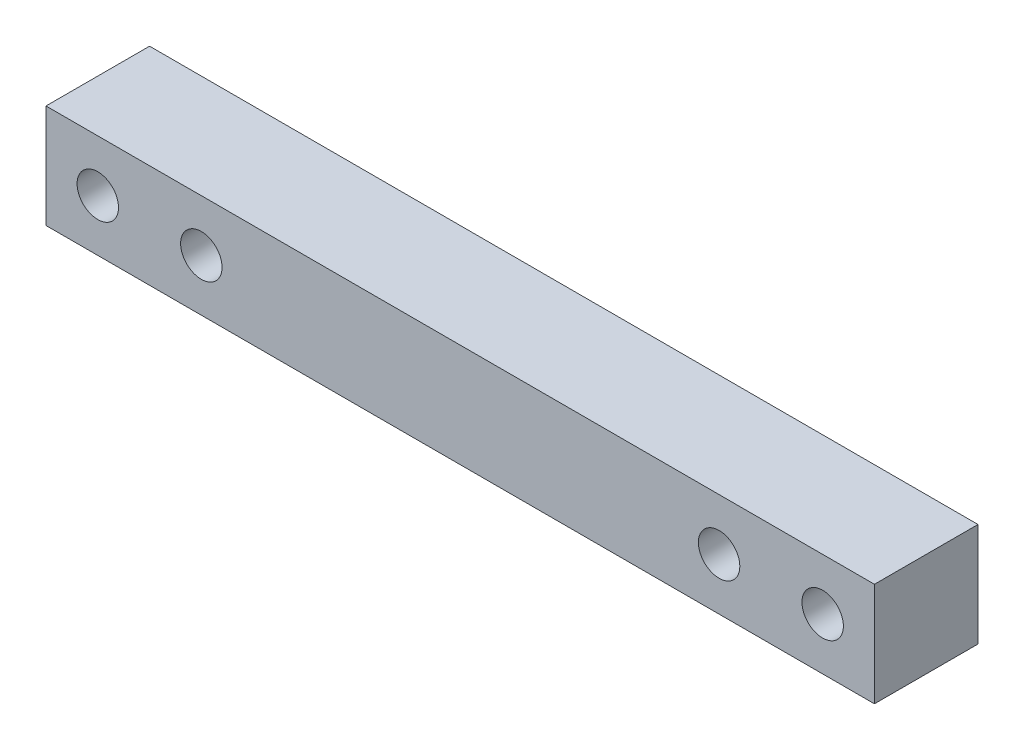
ISO-10303-21;
HEADER;
FILE_DESCRIPTION(('STEP AP214'),'2;1');
FILE_NAME('part.step','',(''),(''),'','','');
FILE_SCHEMA(('AUTOMOTIVE_DESIGN { 1 0 10303 214 1 1 1 1 }'));
ENDSEC;
DATA;
#1=APPLICATION_CONTEXT('core data for automotive mechanical design processes');
#2=APPLICATION_PROTOCOL_DEFINITION('international standard','automotive_design',2000,#1);
#3=PRODUCT_CONTEXT('',#1,'mechanical');
#4=PRODUCT('Part','Part','',(#3));
#5=PRODUCT_RELATED_PRODUCT_CATEGORY('part','',(#4));
#6=PRODUCT_DEFINITION_FORMATION('','',#4);
#7=PRODUCT_DEFINITION_CONTEXT('part definition',#1,'design');
#8=PRODUCT_DEFINITION('design','',#6,#7);
#9=PRODUCT_DEFINITION_SHAPE('','',#8);
#10=(LENGTH_UNIT() NAMED_UNIT(*) SI_UNIT(.MILLI.,.METRE.));
#11=(NAMED_UNIT(*) PLANE_ANGLE_UNIT() SI_UNIT($,.RADIAN.));
#12=(NAMED_UNIT(*) SI_UNIT($,.STERADIAN.) SOLID_ANGLE_UNIT());
#13=UNCERTAINTY_MEASURE_WITH_UNIT(LENGTH_MEASURE(1.E-05),#10,'distance_accuracy_value','');
#14=(GEOMETRIC_REPRESENTATION_CONTEXT(3) GLOBAL_UNCERTAINTY_ASSIGNED_CONTEXT((#13)) GLOBAL_UNIT_ASSIGNED_CONTEXT((#10,
#11,#12)) REPRESENTATION_CONTEXT('',''));
#15=CARTESIAN_POINT('',(0.,0.,0.));
#16=DIRECTION('',(0.,0.,1.));
#17=DIRECTION('',(1.,0.,0.));
#18=AXIS2_PLACEMENT_3D('',#15,#16,#17);
#19=CARTESIAN_POINT('',(-40.,-5.00000000000001,10.));
#20=DIRECTION('',(1.,0.,0.));
#21=DIRECTION('',(0.,0.,-1.));
#22=AXIS2_PLACEMENT_3D('',#19,#20,#21);
#23=PLANE('',#22);
#24=DIRECTION('',(0.,-1.,0.));
#25=VECTOR('',#24,1.);
#26=CARTESIAN_POINT('',(-40.,-5.00000000000001,0.));
#27=LINE('',#26,#25);
#28=CARTESIAN_POINT('',(-40.,4.99999999999999,0.));
#29=VERTEX_POINT('',#28);
#30=CARTESIAN_POINT('',(-40.,-5.00000000000001,0.));
#31=VERTEX_POINT('',#30);
#32=EDGE_CURVE('E98',#29,#31,#27,.T.);
#33=ORIENTED_EDGE('',*,*,#32,.T.);
#34=DIRECTION('',(0.,0.,-1.));
#35=VECTOR('',#34,1.);
#36=CARTESIAN_POINT('',(-40.,-5.00000000000001,10.));
#37=LINE('',#36,#35);
#38=CARTESIAN_POINT('',(-40.,-5.00000000000001,10.));
#39=VERTEX_POINT('',#38);
#40=EDGE_CURVE('E11',#39,#31,#37,.T.);
#41=ORIENTED_EDGE('',*,*,#40,.F.);
#42=DIRECTION('',(0.,-1.,0.));
#43=VECTOR('',#42,1.);
#44=CARTESIAN_POINT('',(-40.,-5.00000000000001,10.));
#45=LINE('',#44,#43);
#46=CARTESIAN_POINT('',(-40.,4.99999999999999,10.));
#47=VERTEX_POINT('',#46);
#48=EDGE_CURVE('E86',#47,#39,#45,.T.);
#49=ORIENTED_EDGE('',*,*,#48,.F.);
#50=DIRECTION('',(0.,0.,-1.));
#51=VECTOR('',#50,1.);
#52=CARTESIAN_POINT('',(-40.,4.99999999999999,10.));
#53=LINE('',#52,#51);
#54=EDGE_CURVE('E94',#47,#29,#53,.T.);
#55=ORIENTED_EDGE('',*,*,#54,.T.);
#56=EDGE_LOOP('',(#33,#41,#49,#55));
#57=FACE_BOUND('',#56,.T.);
#58=ADVANCED_FACE('F35',(#57),#23,.F.);
#59=CARTESIAN_POINT('',(40.,-5.,10.));
#60=DIRECTION('',(0.,1.,0.));
#61=DIRECTION('',(-1.,0.,0.));
#62=AXIS2_PLACEMENT_3D('',#59,#60,#61);
#63=PLANE('',#62);
#64=DIRECTION('',(1.,0.,0.));
#65=VECTOR('',#64,1.);
#66=CARTESIAN_POINT('',(40.,-5.,0.));
#67=LINE('',#66,#65);
#68=CARTESIAN_POINT('',(40.,-5.,0.));
#69=VERTEX_POINT('',#68);
#70=EDGE_CURVE('E90',#31,#69,#67,.T.);
#71=ORIENTED_EDGE('',*,*,#70,.T.);
#72=DIRECTION('',(0.,0.,-1.));
#73=VECTOR('',#72,1.);
#74=CARTESIAN_POINT('',(40.,-5.,10.));
#75=LINE('',#74,#73);
#76=CARTESIAN_POINT('',(40.,-5.,10.));
#77=VERTEX_POINT('',#76);
#78=EDGE_CURVE('E43',#77,#69,#75,.T.);
#79=ORIENTED_EDGE('',*,*,#78,.F.);
#80=DIRECTION('',(1.,0.,0.));
#81=VECTOR('',#80,1.);
#82=CARTESIAN_POINT('',(40.,-5.,10.));
#83=LINE('',#82,#81);
#84=EDGE_CURVE('E81',#39,#77,#83,.T.);
#85=ORIENTED_EDGE('',*,*,#84,.F.);
#86=ORIENTED_EDGE('',*,*,#40,.T.);
#87=EDGE_LOOP('',(#71,#79,#85,#86));
#88=FACE_BOUND('',#87,.T.);
#89=ADVANCED_FACE('F89',(#88),#63,.F.);
#90=CARTESIAN_POINT('',(40.,-5.,10.));
#91=DIRECTION('',(-1.,0.,0.));
#92=DIRECTION('',(0.,0.,1.));
#93=AXIS2_PLACEMENT_3D('',#90,#91,#92);
#94=PLANE('',#93);
#95=DIRECTION('',(0.,1.,0.));
#96=VECTOR('',#95,1.);
#97=CARTESIAN_POINT('',(40.,-5.,0.));
#98=LINE('',#97,#96);
#99=CARTESIAN_POINT('',(40.,5.,0.));
#100=VERTEX_POINT('',#99);
#101=EDGE_CURVE('E68',#69,#100,#98,.T.);
#102=ORIENTED_EDGE('',*,*,#101,.T.);
#103=DIRECTION('',(0.,0.,-1.));
#104=VECTOR('',#103,1.);
#105=CARTESIAN_POINT('',(40.,5.,10.));
#106=LINE('',#105,#104);
#107=CARTESIAN_POINT('',(40.,5.,10.));
#108=VERTEX_POINT('',#107);
#109=EDGE_CURVE('E91',#108,#100,#106,.T.);
#110=ORIENTED_EDGE('',*,*,#109,.F.);
#111=DIRECTION('',(0.,1.,0.));
#112=VECTOR('',#111,1.);
#113=CARTESIAN_POINT('',(40.,-5.,10.));
#114=LINE('',#113,#112);
#115=EDGE_CURVE('E84',#77,#108,#114,.T.);
#116=ORIENTED_EDGE('',*,*,#115,.F.);
#117=ORIENTED_EDGE('',*,*,#78,.T.);
#118=EDGE_LOOP('',(#102,#110,#116,#117));
#119=FACE_BOUND('',#118,.T.);
#120=ADVANCED_FACE('F92',(#119),#94,.F.);
#121=CARTESIAN_POINT('',(40.,5.,10.));
#122=DIRECTION('',(0.,-1.,0.));
#123=DIRECTION('',(1.,0.,0.));
#124=AXIS2_PLACEMENT_3D('',#121,#122,#123);
#125=PLANE('',#124);
#126=DIRECTION('',(-1.,0.,0.));
#127=VECTOR('',#126,1.);
#128=CARTESIAN_POINT('',(40.,5.,0.));
#129=LINE('',#128,#127);
#130=EDGE_CURVE('E74',#100,#29,#129,.T.);
#131=ORIENTED_EDGE('',*,*,#130,.T.);
#132=ORIENTED_EDGE('',*,*,#54,.F.);
#133=DIRECTION('',(-1.,0.,0.));
#134=VECTOR('',#133,1.);
#135=CARTESIAN_POINT('',(40.,5.,10.));
#136=LINE('',#135,#134);
#137=EDGE_CURVE('E51',#108,#47,#136,.T.);
#138=ORIENTED_EDGE('',*,*,#137,.F.);
#139=ORIENTED_EDGE('',*,*,#109,.T.);
#140=EDGE_LOOP('',(#131,#132,#138,#139));
#141=FACE_BOUND('',#140,.T.);
#142=ADVANCED_FACE('F106',(#141),#125,.F.);
#143=CARTESIAN_POINT('',(0.,0.,10.));
#144=DIRECTION('',(0.,0.,1.));
#145=DIRECTION('',(1.,0.,0.));
#146=AXIS2_PLACEMENT_3D('',#143,#144,#145);
#147=PLANE('',#146);
#148=CARTESIAN_POINT('',(35.,0.,10.));
#149=DIRECTION('',(0.,0.,1.));
#150=DIRECTION('',(1.,0.,0.));
#151=AXIS2_PLACEMENT_3D('',#148,#149,#150);
#152=CIRCLE('',#151,2.);
#153=CARTESIAN_POINT('',(37.,0.,10.));
#154=VERTEX_POINT('',#153);
#155=EDGE_CURVE('E130',#154,#154,#152,.T.);
#156=ORIENTED_EDGE('',*,*,#155,.F.);
#157=EDGE_LOOP('',(#156));
#158=FACE_BOUND('',#157,.T.);
#159=CARTESIAN_POINT('',(-25.,0.,10.));
#160=DIRECTION('',(0.,0.,1.));
#161=DIRECTION('',(1.,0.,0.));
#162=AXIS2_PLACEMENT_3D('',#159,#160,#161);
#163=CIRCLE('',#162,2.);
#164=CARTESIAN_POINT('',(-23.,0.,10.));
#165=VERTEX_POINT('',#164);
#166=EDGE_CURVE('E124',#165,#165,#163,.T.);
#167=ORIENTED_EDGE('',*,*,#166,.F.);
#168=EDGE_LOOP('',(#167));
#169=FACE_BOUND('',#168,.T.);
#170=CARTESIAN_POINT('',(25.,0.,10.));
#171=DIRECTION('',(0.,0.,1.));
#172=DIRECTION('',(1.,0.,0.));
#173=AXIS2_PLACEMENT_3D('',#170,#171,#172);
#174=CIRCLE('',#173,2.00000000000001);
#175=CARTESIAN_POINT('',(27.,0.,10.));
#176=VERTEX_POINT('',#175);
#177=EDGE_CURVE('E118',#176,#176,#174,.T.);
#178=ORIENTED_EDGE('',*,*,#177,.F.);
#179=EDGE_LOOP('',(#178));
#180=FACE_BOUND('',#179,.T.);
#181=CARTESIAN_POINT('',(-35.,0.,10.));
#182=DIRECTION('',(0.,0.,1.));
#183=DIRECTION('',(1.,0.,0.));
#184=AXIS2_PLACEMENT_3D('',#181,#182,#183);
#185=CIRCLE('',#184,2.);
#186=CARTESIAN_POINT('',(-33.,0.,10.));
#187=VERTEX_POINT('',#186);
#188=EDGE_CURVE('E112',#187,#187,#185,.T.);
#189=ORIENTED_EDGE('',*,*,#188,.F.);
#190=EDGE_LOOP('',(#189));
#191=FACE_BOUND('',#190,.T.);
#192=ORIENTED_EDGE('',*,*,#48,.T.);
#193=ORIENTED_EDGE('',*,*,#84,.T.);
#194=ORIENTED_EDGE('',*,*,#115,.T.);
#195=ORIENTED_EDGE('',*,*,#137,.T.);
#196=EDGE_LOOP('',(#192,#193,#194,#195));
#197=FACE_BOUND('',#196,.T.);
#198=ADVANCED_FACE('F82',(#158,#169,#180,#191,#197),#147,.T.);
#199=CARTESIAN_POINT('',(0.,0.,0.));
#200=DIRECTION('',(0.,0.,1.));
#201=DIRECTION('',(1.,0.,0.));
#202=AXIS2_PLACEMENT_3D('',#199,#200,#201);
#203=PLANE('',#202);
#204=CARTESIAN_POINT('',(35.,0.,0.));
#205=DIRECTION('',(0.,0.,1.));
#206=DIRECTION('',(1.,0.,0.));
#207=AXIS2_PLACEMENT_3D('',#204,#205,#206);
#208=CIRCLE('',#207,2.);
#209=CARTESIAN_POINT('',(37.,0.,0.));
#210=VERTEX_POINT('',#209);
#211=EDGE_CURVE('E115',#210,#210,#208,.T.);
#212=ORIENTED_EDGE('',*,*,#211,.T.);
#213=EDGE_LOOP('',(#212));
#214=FACE_BOUND('',#213,.T.);
#215=CARTESIAN_POINT('',(-25.,0.,0.));
#216=DIRECTION('',(0.,0.,1.));
#217=DIRECTION('',(1.,0.,0.));
#218=AXIS2_PLACEMENT_3D('',#215,#216,#217);
#219=CIRCLE('',#218,2.);
#220=CARTESIAN_POINT('',(-23.,0.,0.));
#221=VERTEX_POINT('',#220);
#222=EDGE_CURVE('E127',#221,#221,#219,.T.);
#223=ORIENTED_EDGE('',*,*,#222,.T.);
#224=EDGE_LOOP('',(#223));
#225=FACE_BOUND('',#224,.T.);
#226=CARTESIAN_POINT('',(25.,0.,0.));
#227=DIRECTION('',(0.,0.,1.));
#228=DIRECTION('',(1.,0.,0.));
#229=AXIS2_PLACEMENT_3D('',#226,#227,#228);
#230=CIRCLE('',#229,2.00000000000001);
#231=CARTESIAN_POINT('',(27.,0.,0.));
#232=VERTEX_POINT('',#231);
#233=EDGE_CURVE('E121',#232,#232,#230,.T.);
#234=ORIENTED_EDGE('',*,*,#233,.T.);
#235=EDGE_LOOP('',(#234));
#236=FACE_BOUND('',#235,.T.);
#237=CARTESIAN_POINT('',(-35.,0.,0.));
#238=DIRECTION('',(0.,0.,1.));
#239=DIRECTION('',(1.,0.,0.));
#240=AXIS2_PLACEMENT_3D('',#237,#238,#239);
#241=CIRCLE('',#240,2.);
#242=CARTESIAN_POINT('',(-33.,0.,0.));
#243=VERTEX_POINT('',#242);
#244=EDGE_CURVE('E101',#243,#243,#241,.T.);
#245=ORIENTED_EDGE('',*,*,#244,.T.);
#246=EDGE_LOOP('',(#245));
#247=FACE_BOUND('',#246,.T.);
#248=ORIENTED_EDGE('',*,*,#32,.F.);
#249=ORIENTED_EDGE('',*,*,#130,.F.);
#250=ORIENTED_EDGE('',*,*,#101,.F.);
#251=ORIENTED_EDGE('',*,*,#70,.F.);
#252=EDGE_LOOP('',(#248,#249,#250,#251));
#253=FACE_BOUND('',#252,.T.);
#254=ADVANCED_FACE('F109',(#214,#225,#236,#247,#253),#203,.F.);
#255=CARTESIAN_POINT('',(-35.,0.,0.));
#256=DIRECTION('',(0.,0.,1.));
#257=DIRECTION('',(1.,0.,0.));
#258=AXIS2_PLACEMENT_3D('',#255,#256,#257);
#259=CYLINDRICAL_SURFACE('',#258,2.);
#260=ORIENTED_EDGE('',*,*,#244,.F.);
#261=EDGE_LOOP('',(#260));
#262=FACE_BOUND('',#261,.T.);
#263=ORIENTED_EDGE('',*,*,#188,.T.);
#264=EDGE_LOOP('',(#263));
#265=FACE_BOUND('',#264,.T.);
#266=ADVANCED_FACE('F154',(#262,#265),#259,.F.);
#267=CARTESIAN_POINT('',(25.,0.,0.));
#268=DIRECTION('',(0.,0.,1.));
#269=DIRECTION('',(1.,0.,0.));
#270=AXIS2_PLACEMENT_3D('',#267,#268,#269);
#271=CYLINDRICAL_SURFACE('',#270,2.00000000000001);
#272=ORIENTED_EDGE('',*,*,#233,.F.);
#273=EDGE_LOOP('',(#272));
#274=FACE_BOUND('',#273,.T.);
#275=ORIENTED_EDGE('',*,*,#177,.T.);
#276=EDGE_LOOP('',(#275));
#277=FACE_BOUND('',#276,.T.);
#278=ADVANCED_FACE('F156',(#274,#277),#271,.F.);
#279=CARTESIAN_POINT('',(-25.,0.,0.));
#280=DIRECTION('',(0.,0.,1.));
#281=DIRECTION('',(1.,0.,0.));
#282=AXIS2_PLACEMENT_3D('',#279,#280,#281);
#283=CYLINDRICAL_SURFACE('',#282,2.);
#284=ORIENTED_EDGE('',*,*,#222,.F.);
#285=EDGE_LOOP('',(#284));
#286=FACE_BOUND('',#285,.T.);
#287=ORIENTED_EDGE('',*,*,#166,.T.);
#288=EDGE_LOOP('',(#287));
#289=FACE_BOUND('',#288,.T.);
#290=ADVANCED_FACE('F141',(#286,#289),#283,.F.);
#291=CARTESIAN_POINT('',(35.,0.,0.));
#292=DIRECTION('',(0.,0.,1.));
#293=DIRECTION('',(1.,0.,0.));
#294=AXIS2_PLACEMENT_3D('',#291,#292,#293);
#295=CYLINDRICAL_SURFACE('',#294,2.);
#296=ORIENTED_EDGE('',*,*,#211,.F.);
#297=EDGE_LOOP('',(#296));
#298=FACE_BOUND('',#297,.T.);
#299=ORIENTED_EDGE('',*,*,#155,.T.);
#300=EDGE_LOOP('',(#299));
#301=FACE_BOUND('',#300,.T.);
#302=ADVANCED_FACE('F138',(#298,#301),#295,.F.);
#303=CLOSED_SHELL('',(#58,#89,#120,#142,#198,#254,#266,#278,#290,#302));
#304=MANIFOLD_SOLID_BREP('B2',#303);
#305=ADVANCED_BREP_SHAPE_REPRESENTATION('',(#18,#304),#14);
#306=SHAPE_DEFINITION_REPRESENTATION(#9,#305);
ENDSEC;
END-ISO-10303-21;
